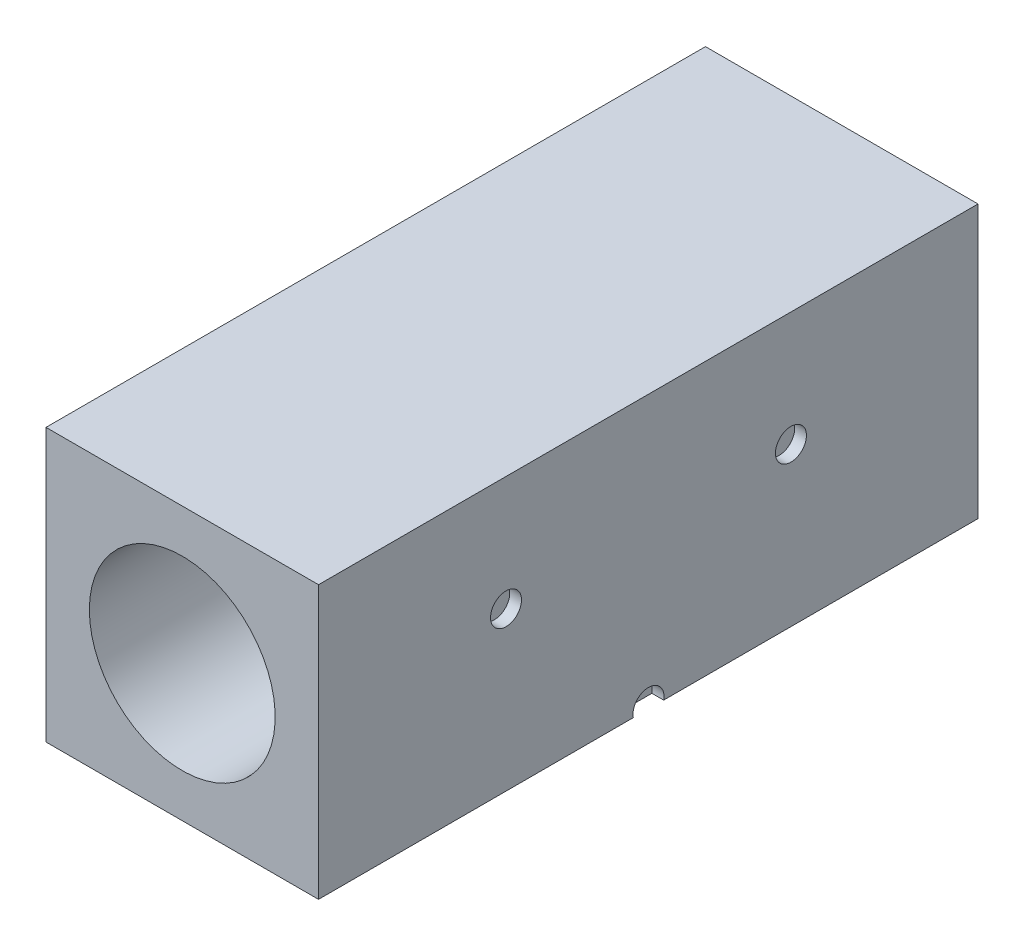
ISO-10303-21;
HEADER;
FILE_DESCRIPTION(('STEP AP214'),'2;1');
FILE_NAME('part.step','',(''),(''),'','','');
FILE_SCHEMA(('AUTOMOTIVE_DESIGN { 1 0 10303 214 1 1 1 1 }'));
ENDSEC;
DATA;
#1=APPLICATION_CONTEXT('core data for automotive mechanical design processes');
#2=APPLICATION_PROTOCOL_DEFINITION('international standard','automotive_design',2000,#1);
#3=PRODUCT_CONTEXT('',#1,'mechanical');
#4=PRODUCT('Part','Part','',(#3));
#5=PRODUCT_RELATED_PRODUCT_CATEGORY('part','',(#4));
#6=PRODUCT_DEFINITION_FORMATION('','',#4);
#7=PRODUCT_DEFINITION_CONTEXT('part definition',#1,'design');
#8=PRODUCT_DEFINITION('design','',#6,#7);
#9=PRODUCT_DEFINITION_SHAPE('','',#8);
#10=(LENGTH_UNIT() NAMED_UNIT(*) SI_UNIT(.MILLI.,.METRE.));
#11=(NAMED_UNIT(*) PLANE_ANGLE_UNIT() SI_UNIT($,.RADIAN.));
#12=(NAMED_UNIT(*) SI_UNIT($,.STERADIAN.) SOLID_ANGLE_UNIT());
#13=UNCERTAINTY_MEASURE_WITH_UNIT(LENGTH_MEASURE(1.E-05),#10,'distance_accuracy_value','');
#14=(GEOMETRIC_REPRESENTATION_CONTEXT(3) GLOBAL_UNCERTAINTY_ASSIGNED_CONTEXT((#13)) GLOBAL_UNIT_ASSIGNED_CONTEXT((#10,
#11,#12)) REPRESENTATION_CONTEXT('',''));
#15=CARTESIAN_POINT('',(0.,0.,0.));
#16=DIRECTION('',(0.,0.,1.));
#17=DIRECTION('',(1.,0.,0.));
#18=AXIS2_PLACEMENT_3D('',#15,#16,#17);
#19=CARTESIAN_POINT('',(-22.,-22.,106.47));
#20=DIRECTION('',(0.,1.,0.));
#21=DIRECTION('',(0.,0.,1.));
#22=AXIS2_PLACEMENT_3D('',#19,#20,#21);
#23=PLANE('',#22);
#24=DIRECTION('',(1.,0.,0.));
#25=VECTOR('',#24,1.);
#26=CARTESIAN_POINT('',(20.1,-22.,55.6493299851645));
#27=LINE('',#26,#25);
#28=CARTESIAN_POINT('',(22.,-22.,55.6493299851645));
#29=VERTEX_POINT('',#28);
#30=CARTESIAN_POINT('',(20.1,-22.,55.6493299851645));
#31=VERTEX_POINT('',#30);
#32=EDGE_CURVE('E11',#29,#31,#27,.F.);
#33=ORIENTED_EDGE('',*,*,#32,.F.);
#34=DIRECTION('',(0.,0.,-1.));
#35=VECTOR('',#34,1.);
#36=CARTESIAN_POINT('',(22.,-22.,106.47));
#37=LINE('',#36,#35);
#38=CARTESIAN_POINT('',(22.,-22.,106.47));
#39=VERTEX_POINT('',#38);
#40=EDGE_CURVE('E112',#39,#29,#37,.T.);
#41=ORIENTED_EDGE('',*,*,#40,.F.);
#42=DIRECTION('',(1.,0.,0.));
#43=VECTOR('',#42,1.);
#44=CARTESIAN_POINT('',(-22.,-22.,106.47));
#45=LINE('',#44,#43);
#46=CARTESIAN_POINT('',(-22.,-22.,106.47));
#47=VERTEX_POINT('',#46);
#48=EDGE_CURVE('E117',#47,#39,#45,.T.);
#49=ORIENTED_EDGE('',*,*,#48,.F.);
#50=DIRECTION('',(0.,0.,-1.));
#51=VECTOR('',#50,1.);
#52=CARTESIAN_POINT('',(-22.,-22.,106.47));
#53=LINE('',#52,#51);
#54=CARTESIAN_POINT('',(-22.,-22.,55.6493299851645));
#55=VERTEX_POINT('',#54);
#56=EDGE_CURVE('E125',#47,#55,#53,.T.);
#57=ORIENTED_EDGE('',*,*,#56,.T.);
#58=DIRECTION('',(-1.,0.,0.));
#59=VECTOR('',#58,1.);
#60=CARTESIAN_POINT('',(-20.1,-22.,55.6493299851645));
#61=LINE('',#60,#59);
#62=CARTESIAN_POINT('',(-20.1,-22.,55.6493299851645));
#63=VERTEX_POINT('',#62);
#64=EDGE_CURVE('E136',#55,#63,#61,.F.);
#65=ORIENTED_EDGE('',*,*,#64,.T.);
#66=DIRECTION('',(0.,0.,1.));
#67=VECTOR('',#66,1.);
#68=CARTESIAN_POINT('',(-20.1,-22.,106.47));
#69=LINE('',#68,#67);
#70=CARTESIAN_POINT('',(-20.1,-22.,50.7506700148355));
#71=VERTEX_POINT('',#70);
#72=EDGE_CURVE('E134',#71,#63,#69,.T.);
#73=ORIENTED_EDGE('',*,*,#72,.F.);
#74=DIRECTION('',(-1.,0.,0.));
#75=VECTOR('',#74,1.);
#76=CARTESIAN_POINT('',(-20.1,-22.,50.7506700148355));
#77=LINE('',#76,#75);
#78=CARTESIAN_POINT('',(-22.,-22.,50.7506700148355));
#79=VERTEX_POINT('',#78);
#80=EDGE_CURVE('E139',#71,#79,#77,.T.);
#81=ORIENTED_EDGE('',*,*,#80,.T.);
#82=CARTESIAN_POINT('',(-22.,-22.,0.));
#83=VERTEX_POINT('',#82);
#84=EDGE_CURVE('E119',#79,#83,#53,.T.);
#85=ORIENTED_EDGE('',*,*,#84,.T.);
#86=DIRECTION('',(1.,0.,0.));
#87=VECTOR('',#86,1.);
#88=CARTESIAN_POINT('',(-22.,-22.,0.));
#89=LINE('',#88,#87);
#90=CARTESIAN_POINT('',(22.,-22.,0.));
#91=VERTEX_POINT('',#90);
#92=EDGE_CURVE('E115',#83,#91,#89,.T.);
#93=ORIENTED_EDGE('',*,*,#92,.T.);
#94=CARTESIAN_POINT('',(22.,-22.,50.7506700148355));
#95=VERTEX_POINT('',#94);
#96=EDGE_CURVE('E108',#95,#91,#37,.T.);
#97=ORIENTED_EDGE('',*,*,#96,.F.);
#98=DIRECTION('',(1.,0.,0.));
#99=VECTOR('',#98,1.);
#100=CARTESIAN_POINT('',(20.1,-22.,50.7506700148355));
#101=LINE('',#100,#99);
#102=CARTESIAN_POINT('',(20.1,-22.,50.7506700148355));
#103=VERTEX_POINT('',#102);
#104=EDGE_CURVE('E42',#103,#95,#101,.T.);
#105=ORIENTED_EDGE('',*,*,#104,.F.);
#106=DIRECTION('',(0.,0.,-1.));
#107=VECTOR('',#106,1.);
#108=CARTESIAN_POINT('',(20.1,-22.,106.47));
#109=LINE('',#108,#107);
#110=EDGE_CURVE('E104',#31,#103,#109,.T.);
#111=ORIENTED_EDGE('',*,*,#110,.F.);
#112=EDGE_LOOP('',(#33,#41,#49,#57,#65,#73,#81,#85,#93,#97,#105,#111));
#113=FACE_BOUND('',#112,.T.);
#114=ADVANCED_FACE('F34',(#113),#23,.F.);
#115=CARTESIAN_POINT('',(22.,-22.,106.47));
#116=DIRECTION('',(-1.,0.,0.));
#117=DIRECTION('',(0.,0.,1.));
#118=AXIS2_PLACEMENT_3D('',#115,#116,#117);
#119=PLANE('',#118);
#120=CARTESIAN_POINT('',(22.,3.5,30.2));
#121=DIRECTION('',(-1.,0.,0.));
#122=DIRECTION('',(0.,0.,1.));
#123=AXIS2_PLACEMENT_3D('',#120,#121,#122);
#124=CIRCLE('',#123,2.5);
#125=CARTESIAN_POINT('',(22.,3.5,27.7));
#126=VERTEX_POINT('',#125);
#127=EDGE_CURVE('E273',#126,#126,#124,.T.);
#128=ORIENTED_EDGE('',*,*,#127,.T.);
#129=EDGE_LOOP('',(#128));
#130=FACE_BOUND('',#129,.T.);
#131=CARTESIAN_POINT('',(22.,3.5,76.2));
#132=DIRECTION('',(-1.,0.,0.));
#133=DIRECTION('',(0.,0.,1.));
#134=AXIS2_PLACEMENT_3D('',#131,#132,#133);
#135=CIRCLE('',#134,2.5);
#136=CARTESIAN_POINT('',(22.,3.5,73.7));
#137=VERTEX_POINT('',#136);
#138=EDGE_CURVE('E281',#137,#137,#135,.T.);
#139=ORIENTED_EDGE('',*,*,#138,.T.);
#140=EDGE_LOOP('',(#139));
#141=FACE_BOUND('',#140,.T.);
#142=CARTESIAN_POINT('',(22.,-21.4992179877691,53.2));
#143=DIRECTION('',(-1.,0.,0.));
#144=DIRECTION('',(0.,0.,1.));
#145=AXIS2_PLACEMENT_3D('',#142,#143,#144);
#146=CIRCLE('',#145,2.5);
#147=EDGE_CURVE('E99',#29,#95,#146,.T.);
#148=ORIENTED_EDGE('',*,*,#147,.T.);
#149=ORIENTED_EDGE('',*,*,#96,.T.);
#150=DIRECTION('',(0.,1.,0.));
#151=VECTOR('',#150,1.);
#152=CARTESIAN_POINT('',(22.,-22.,0.));
#153=LINE('',#152,#151);
#154=CARTESIAN_POINT('',(22.,22.,0.));
#155=VERTEX_POINT('',#154);
#156=EDGE_CURVE('E157',#91,#155,#153,.T.);
#157=ORIENTED_EDGE('',*,*,#156,.T.);
#158=DIRECTION('',(0.,0.,-1.));
#159=VECTOR('',#158,1.);
#160=CARTESIAN_POINT('',(22.,22.,106.47));
#161=LINE('',#160,#159);
#162=CARTESIAN_POINT('',(22.,22.,106.47));
#163=VERTEX_POINT('',#162);
#164=EDGE_CURVE('E131',#163,#155,#161,.T.);
#165=ORIENTED_EDGE('',*,*,#164,.F.);
#166=DIRECTION('',(0.,1.,0.));
#167=VECTOR('',#166,1.);
#168=CARTESIAN_POINT('',(22.,-22.,106.47));
#169=LINE('',#168,#167);
#170=EDGE_CURVE('E146',#39,#163,#169,.T.);
#171=ORIENTED_EDGE('',*,*,#170,.F.);
#172=ORIENTED_EDGE('',*,*,#40,.T.);
#173=EDGE_LOOP('',(#148,#149,#157,#165,#171,#172));
#174=FACE_BOUND('',#173,.T.);
#175=ADVANCED_FACE('F36',(#130,#141,#174),#119,.F.);
#176=CARTESIAN_POINT('',(-22.,22.,106.47));
#177=DIRECTION('',(0.,-1.,0.));
#178=DIRECTION('',(0.,0.,-1.));
#179=AXIS2_PLACEMENT_3D('',#176,#177,#178);
#180=PLANE('',#179);
#181=DIRECTION('',(-1.,0.,0.));
#182=VECTOR('',#181,1.);
#183=CARTESIAN_POINT('',(-22.,22.,0.));
#184=LINE('',#183,#182);
#185=CARTESIAN_POINT('',(-22.,22.,0.));
#186=VERTEX_POINT('',#185);
#187=EDGE_CURVE('E159',#155,#186,#184,.T.);
#188=ORIENTED_EDGE('',*,*,#187,.T.);
#189=DIRECTION('',(0.,0.,-1.));
#190=VECTOR('',#189,1.);
#191=CARTESIAN_POINT('',(-22.,22.,106.47));
#192=LINE('',#191,#190);
#193=CARTESIAN_POINT('',(-22.,22.,106.47));
#194=VERTEX_POINT('',#193);
#195=EDGE_CURVE('E128',#194,#186,#192,.T.);
#196=ORIENTED_EDGE('',*,*,#195,.F.);
#197=DIRECTION('',(-1.,0.,0.));
#198=VECTOR('',#197,1.);
#199=CARTESIAN_POINT('',(-22.,22.,106.47));
#200=LINE('',#199,#198);
#201=EDGE_CURVE('E148',#163,#194,#200,.T.);
#202=ORIENTED_EDGE('',*,*,#201,.F.);
#203=ORIENTED_EDGE('',*,*,#164,.T.);
#204=EDGE_LOOP('',(#188,#196,#202,#203));
#205=FACE_BOUND('',#204,.T.);
#206=ADVANCED_FACE('F172',(#205),#180,.F.);
#207=CARTESIAN_POINT('',(-22.,-22.,106.47));
#208=DIRECTION('',(1.,0.,0.));
#209=DIRECTION('',(0.,0.,-1.));
#210=AXIS2_PLACEMENT_3D('',#207,#208,#209);
#211=PLANE('',#210);
#212=CARTESIAN_POINT('',(-22.,3.5,30.2));
#213=DIRECTION('',(-1.,0.,0.));
#214=DIRECTION('',(0.,0.,1.));
#215=AXIS2_PLACEMENT_3D('',#212,#213,#214);
#216=CIRCLE('',#215,2.5);
#217=CARTESIAN_POINT('',(-22.,3.5,32.7));
#218=VERTEX_POINT('',#217);
#219=EDGE_CURVE('E195',#218,#218,#216,.T.);
#220=ORIENTED_EDGE('',*,*,#219,.F.);
#221=EDGE_LOOP('',(#220));
#222=FACE_BOUND('',#221,.T.);
#223=CARTESIAN_POINT('',(-22.,3.5,76.2));
#224=DIRECTION('',(-1.,0.,0.));
#225=DIRECTION('',(0.,0.,1.));
#226=AXIS2_PLACEMENT_3D('',#223,#224,#225);
#227=CIRCLE('',#226,2.5);
#228=CARTESIAN_POINT('',(-22.,3.5,78.7));
#229=VERTEX_POINT('',#228);
#230=EDGE_CURVE('E179',#229,#229,#227,.T.);
#231=ORIENTED_EDGE('',*,*,#230,.F.);
#232=EDGE_LOOP('',(#231));
#233=FACE_BOUND('',#232,.T.);
#234=ORIENTED_EDGE('',*,*,#84,.F.);
#235=CARTESIAN_POINT('',(-22.,-21.4992179877691,53.2));
#236=DIRECTION('',(-1.,0.,0.));
#237=DIRECTION('',(0.,0.,1.));
#238=AXIS2_PLACEMENT_3D('',#235,#236,#237);
#239=CIRCLE('',#238,2.5);
#240=EDGE_CURVE('E175',#55,#79,#239,.T.);
#241=ORIENTED_EDGE('',*,*,#240,.F.);
#242=ORIENTED_EDGE('',*,*,#56,.F.);
#243=DIRECTION('',(0.,-1.,0.));
#244=VECTOR('',#243,1.);
#245=CARTESIAN_POINT('',(-22.,-22.,106.47));
#246=LINE('',#245,#244);
#247=EDGE_CURVE('E120',#194,#47,#246,.T.);
#248=ORIENTED_EDGE('',*,*,#247,.F.);
#249=ORIENTED_EDGE('',*,*,#195,.T.);
#250=DIRECTION('',(0.,-1.,0.));
#251=VECTOR('',#250,1.);
#252=CARTESIAN_POINT('',(-22.,-22.,0.));
#253=LINE('',#252,#251);
#254=EDGE_CURVE('E151',#186,#83,#253,.T.);
#255=ORIENTED_EDGE('',*,*,#254,.T.);
#256=EDGE_LOOP('',(#234,#241,#242,#248,#249,#255));
#257=FACE_BOUND('',#256,.T.);
#258=ADVANCED_FACE('F165',(#222,#233,#257),#211,.F.);
#259=CARTESIAN_POINT('',(0.,0.,106.47));
#260=DIRECTION('',(0.,0.,-1.));
#261=DIRECTION('',(-1.,0.,0.));
#262=AXIS2_PLACEMENT_3D('',#259,#260,#261);
#263=PLANE('',#262);
#264=CARTESIAN_POINT('',(0.,0.,106.47));
#265=DIRECTION('',(0.,0.,-1.));
#266=DIRECTION('',(-1.,0.,0.));
#267=AXIS2_PLACEMENT_3D('',#264,#265,#266);
#268=CIRCLE('',#267,15.);
#269=CARTESIAN_POINT('',(-15.,0.,106.47));
#270=VERTEX_POINT('',#269);
#271=EDGE_CURVE('E160',#270,#270,#268,.T.);
#272=ORIENTED_EDGE('',*,*,#271,.T.);
#273=EDGE_LOOP('',(#272));
#274=FACE_BOUND('',#273,.T.);
#275=ORIENTED_EDGE('',*,*,#170,.T.);
#276=ORIENTED_EDGE('',*,*,#201,.T.);
#277=ORIENTED_EDGE('',*,*,#247,.T.);
#278=ORIENTED_EDGE('',*,*,#48,.T.);
#279=EDGE_LOOP('',(#275,#276,#277,#278));
#280=FACE_BOUND('',#279,.T.);
#281=ADVANCED_FACE('F173',(#274,#280),#263,.F.);
#282=CARTESIAN_POINT('',(0.,0.,0.));
#283=DIRECTION('',(0.,0.,-1.));
#284=DIRECTION('',(-1.,0.,0.));
#285=AXIS2_PLACEMENT_3D('',#282,#283,#284);
#286=PLANE('',#285);
#287=CARTESIAN_POINT('',(0.,0.,0.));
#288=DIRECTION('',(0.,0.,-1.));
#289=DIRECTION('',(-1.,0.,0.));
#290=AXIS2_PLACEMENT_3D('',#287,#288,#289);
#291=CIRCLE('',#290,15.);
#292=CARTESIAN_POINT('',(-15.,0.,0.));
#293=VERTEX_POINT('',#292);
#294=EDGE_CURVE('E153',#293,#293,#291,.T.);
#295=ORIENTED_EDGE('',*,*,#294,.F.);
#296=EDGE_LOOP('',(#295));
#297=FACE_BOUND('',#296,.T.);
#298=ORIENTED_EDGE('',*,*,#156,.F.);
#299=ORIENTED_EDGE('',*,*,#92,.F.);
#300=ORIENTED_EDGE('',*,*,#254,.F.);
#301=ORIENTED_EDGE('',*,*,#187,.F.);
#302=EDGE_LOOP('',(#298,#299,#300,#301));
#303=FACE_BOUND('',#302,.T.);
#304=ADVANCED_FACE('F170',(#297,#303),#286,.T.);
#305=CARTESIAN_POINT('',(0.,0.,106.47));
#306=DIRECTION('',(0.,0.,-1.));
#307=DIRECTION('',(-1.,0.,0.));
#308=AXIS2_PLACEMENT_3D('',#305,#306,#307);
#309=CYLINDRICAL_SURFACE('',#308,15.);
#310=CARTESIAN_POINT('',(-15.,0.,106.47));
#311=CARTESIAN_POINT('',(-15.,0.,105.3609375));
#312=CARTESIAN_POINT('',(-15.,0.,104.251875));
#313=CARTESIAN_POINT('',(-15.,0.,102.03375));
#314=CARTESIAN_POINT('',(-15.,0.,100.9246875));
#315=CARTESIAN_POINT('',(-15.,0.,98.7065625));
#316=CARTESIAN_POINT('',(-15.,0.,97.5975));
#317=CARTESIAN_POINT('',(-15.,0.,95.379375));
#318=CARTESIAN_POINT('',(-15.,0.,94.2703125));
#319=CARTESIAN_POINT('',(-15.,0.,92.0521875));
#320=CARTESIAN_POINT('',(-15.,0.,90.943125));
#321=CARTESIAN_POINT('',(-15.,0.,88.725));
#322=CARTESIAN_POINT('',(-15.,0.,87.6159375));
#323=CARTESIAN_POINT('',(-15.,0.,85.3978125));
#324=CARTESIAN_POINT('',(-15.,0.,84.28875));
#325=CARTESIAN_POINT('',(-15.,0.,82.070625));
#326=CARTESIAN_POINT('',(-15.,0.,80.9615625));
#327=CARTESIAN_POINT('',(-15.,0.,78.7434375));
#328=CARTESIAN_POINT('',(-15.,0.,77.634375));
#329=CARTESIAN_POINT('',(-15.,0.,75.41625));
#330=CARTESIAN_POINT('',(-15.,0.,74.3071875));
#331=CARTESIAN_POINT('',(-15.,0.,72.0890625));
#332=CARTESIAN_POINT('',(-15.,0.,70.98));
#333=CARTESIAN_POINT('',(-15.,0.,68.761875));
#334=CARTESIAN_POINT('',(-15.,0.,67.6528125));
#335=CARTESIAN_POINT('',(-15.,0.,65.4346875));
#336=CARTESIAN_POINT('',(-15.,0.,64.325625));
#337=CARTESIAN_POINT('',(-15.,0.,62.1075));
#338=CARTESIAN_POINT('',(-15.,0.,60.9984375));
#339=CARTESIAN_POINT('',(-15.,0.,58.7803125));
#340=CARTESIAN_POINT('',(-15.,0.,57.67125));
#341=CARTESIAN_POINT('',(-15.,0.,55.453125));
#342=CARTESIAN_POINT('',(-15.,0.,54.3440625));
#343=CARTESIAN_POINT('',(-15.,0.,52.1259375));
#344=CARTESIAN_POINT('',(-15.,0.,51.016875));
#345=CARTESIAN_POINT('',(-15.,0.,48.79875));
#346=CARTESIAN_POINT('',(-15.,0.,47.6896875));
#347=CARTESIAN_POINT('',(-15.,0.,45.4715625));
#348=CARTESIAN_POINT('',(-15.,0.,44.3625));
#349=CARTESIAN_POINT('',(-15.,0.,42.144375));
#350=CARTESIAN_POINT('',(-15.,0.,41.0353125));
#351=CARTESIAN_POINT('',(-15.,0.,38.8171875));
#352=CARTESIAN_POINT('',(-15.,0.,37.708125));
#353=CARTESIAN_POINT('',(-15.,0.,35.49));
#354=CARTESIAN_POINT('',(-15.,0.,34.3809375));
#355=CARTESIAN_POINT('',(-15.,0.,32.1628125));
#356=CARTESIAN_POINT('',(-15.,0.,31.05375));
#357=CARTESIAN_POINT('',(-15.,0.,28.835625));
#358=CARTESIAN_POINT('',(-15.,0.,27.7265625));
#359=CARTESIAN_POINT('',(-15.,0.,25.5084375));
#360=CARTESIAN_POINT('',(-15.,0.,24.399375));
#361=CARTESIAN_POINT('',(-15.,0.,22.18125));
#362=CARTESIAN_POINT('',(-15.,0.,21.0721875));
#363=CARTESIAN_POINT('',(-15.,0.,18.8540625));
#364=CARTESIAN_POINT('',(-15.,0.,17.745));
#365=CARTESIAN_POINT('',(-15.,0.,15.526875));
#366=CARTESIAN_POINT('',(-15.,0.,14.4178125));
#367=CARTESIAN_POINT('',(-15.,0.,12.1996875));
#368=CARTESIAN_POINT('',(-15.,0.,11.090625));
#369=CARTESIAN_POINT('',(-15.,0.,8.8725));
#370=CARTESIAN_POINT('',(-15.,0.,7.7634375));
#371=CARTESIAN_POINT('',(-15.,0.,5.5453125));
#372=CARTESIAN_POINT('',(-15.,0.,4.43625));
#373=CARTESIAN_POINT('',(-15.,0.,2.218125));
#374=CARTESIAN_POINT('',(-15.,0.,1.1090625));
#375=CARTESIAN_POINT('',(-15.,0.,0.));
#376=B_SPLINE_CURVE_WITH_KNOTS('',3,(#310,#311,#312,#313,#314,#315,#316,#317,#318,#319,#320,
#321,#322,#323,#324,#325,#326,#327,#328,#329,#330,#331,#332,#333,#334,#335,#336,#337,#338,#339,
#340,#341,#342,#343,#344,#345,#346,#347,#348,#349,#350,#351,#352,#353,#354,#355,#356,#357,#358,
#359,#360,#361,#362,#363,#364,#365,#366,#367,#368,#369,#370,#371,#372,#373,#374,#375),
.UNSPECIFIED.,.F.,.F.,(4,2,2,2,2,2,2,2,2,2,2,2,2,2,2,2,2,2,2,2,2,2,2,2,2,2,2,2,2,2,2,2,4),(0.,
3.32718750000001,6.654375,9.98156250000001,13.30875,16.6359375,19.963125,23.2903125,26.6175,
29.9446875,33.271875,36.5990625,39.92625,43.2534375,46.580625,49.9078125,53.235,56.5621875,
59.889375,63.2165625,66.54375,69.8709375,73.198125,76.5253125,79.8525,83.1796875,86.506875,
89.8340625,93.16125,96.4884375,99.815625,103.1428125,106.47),.UNSPECIFIED.);
#377=EDGE_CURVE('BSEAM231',#270,#293,#376,.T.);
#378=ORIENTED_EDGE('',*,*,#271,.F.);
#379=ORIENTED_EDGE('',*,*,#294,.T.);
#380=ORIENTED_EDGE('',*,*,#377,.T.);
#381=ORIENTED_EDGE('',*,*,#377,.F.);
#382=EDGE_LOOP('',(#378,#380,#379,#381));
#383=FACE_BOUND('',#382,.T.);
#384=ADVANCED_FACE('F231',(#383),#309,.F.);
#385=CARTESIAN_POINT('',(-20.1,-21.4992179877691,53.2));
#386=DIRECTION('',(-1.,0.,0.));
#387=DIRECTION('',(0.,0.,1.));
#388=AXIS2_PLACEMENT_3D('',#385,#386,#387);
#389=CYLINDRICAL_SURFACE('',#388,2.5);
#390=CARTESIAN_POINT('',(-20.1,-21.4992179877691,53.2));
#391=DIRECTION('',(-1.,0.,0.));
#392=DIRECTION('',(0.,0.,1.));
#393=AXIS2_PLACEMENT_3D('',#390,#391,#392);
#394=CIRCLE('',#393,2.5);
#395=EDGE_CURVE('E54',#63,#71,#394,.T.);
#396=ORIENTED_EDGE('',*,*,#395,.F.);
#397=ORIENTED_EDGE('',*,*,#64,.F.);
#398=ORIENTED_EDGE('',*,*,#240,.T.);
#399=ORIENTED_EDGE('',*,*,#80,.F.);
#400=EDGE_LOOP('',(#396,#397,#398,#399));
#401=FACE_BOUND('',#400,.T.);
#402=ADVANCED_FACE('F178',(#401),#389,.F.);
#403=CARTESIAN_POINT('',(-20.1,-21.4992179877691,53.2));
#404=DIRECTION('',(-1.,0.,0.));
#405=DIRECTION('',(0.,0.,1.));
#406=AXIS2_PLACEMENT_3D('',#403,#404,#405);
#407=PLANE('',#406);
#408=ORIENTED_EDGE('',*,*,#72,.T.);
#409=ORIENTED_EDGE('',*,*,#395,.T.);
#410=EDGE_LOOP('',(#408,#409));
#411=FACE_BOUND('',#410,.T.);
#412=ADVANCED_FACE('F210',(#411),#407,.T.);
#413=CARTESIAN_POINT('',(-20.1,3.5,76.2));
#414=DIRECTION('',(-1.,0.,0.));
#415=DIRECTION('',(0.,0.,1.));
#416=AXIS2_PLACEMENT_3D('',#413,#414,#415);
#417=CYLINDRICAL_SURFACE('',#416,2.5);
#418=CARTESIAN_POINT('',(-20.1,3.5,76.2));
#419=DIRECTION('',(-1.,0.,0.));
#420=DIRECTION('',(0.,0.,1.));
#421=AXIS2_PLACEMENT_3D('',#418,#419,#420);
#422=CIRCLE('',#421,2.5);
#423=CARTESIAN_POINT('',(-20.1,3.5,78.7));
#424=VERTEX_POINT('',#423);
#425=EDGE_CURVE('E182',#424,#424,#422,.T.);
#426=CARTESIAN_POINT('',(-20.1,3.5,78.7));
#427=CARTESIAN_POINT('',(-20.1197916666667,3.5,78.7));
#428=CARTESIAN_POINT('',(-20.1395833333333,3.5,78.7));
#429=CARTESIAN_POINT('',(-20.1791666666667,3.5,78.7));
#430=CARTESIAN_POINT('',(-20.1989583333333,3.5,78.7));
#431=CARTESIAN_POINT('',(-20.2385416666667,3.5,78.7));
#432=CARTESIAN_POINT('',(-20.2583333333333,3.5,78.7));
#433=CARTESIAN_POINT('',(-20.2979166666667,3.5,78.7));
#434=CARTESIAN_POINT('',(-20.3177083333333,3.5,78.7));
#435=CARTESIAN_POINT('',(-20.3572916666667,3.5,78.7));
#436=CARTESIAN_POINT('',(-20.3770833333333,3.5,78.7));
#437=CARTESIAN_POINT('',(-20.4166666666667,3.5,78.7));
#438=CARTESIAN_POINT('',(-20.4364583333333,3.5,78.7));
#439=CARTESIAN_POINT('',(-20.4760416666667,3.5,78.7));
#440=CARTESIAN_POINT('',(-20.4958333333333,3.5,78.7));
#441=CARTESIAN_POINT('',(-20.5354166666667,3.5,78.7));
#442=CARTESIAN_POINT('',(-20.5552083333333,3.5,78.7));
#443=CARTESIAN_POINT('',(-20.5947916666667,3.5,78.7));
#444=CARTESIAN_POINT('',(-20.6145833333333,3.5,78.7));
#445=CARTESIAN_POINT('',(-20.6541666666667,3.5,78.7));
#446=CARTESIAN_POINT('',(-20.6739583333333,3.5,78.7));
#447=CARTESIAN_POINT('',(-20.7135416666667,3.5,78.7));
#448=CARTESIAN_POINT('',(-20.7333333333333,3.5,78.7));
#449=CARTESIAN_POINT('',(-20.7729166666667,3.5,78.7));
#450=CARTESIAN_POINT('',(-20.7927083333333,3.5,78.7));
#451=CARTESIAN_POINT('',(-20.8322916666667,3.5,78.7));
#452=CARTESIAN_POINT('',(-20.8520833333333,3.5,78.7));
#453=CARTESIAN_POINT('',(-20.8916666666667,3.5,78.7));
#454=CARTESIAN_POINT('',(-20.9114583333333,3.5,78.7));
#455=CARTESIAN_POINT('',(-20.9510416666667,3.5,78.7));
#456=CARTESIAN_POINT('',(-20.9708333333333,3.5,78.7));
#457=CARTESIAN_POINT('',(-21.0104166666667,3.5,78.7));
#458=CARTESIAN_POINT('',(-21.0302083333333,3.5,78.7));
#459=CARTESIAN_POINT('',(-21.0697916666667,3.5,78.7));
#460=CARTESIAN_POINT('',(-21.0895833333333,3.5,78.7));
#461=CARTESIAN_POINT('',(-21.1291666666667,3.5,78.7));
#462=CARTESIAN_POINT('',(-21.1489583333333,3.5,78.7));
#463=CARTESIAN_POINT('',(-21.1885416666667,3.5,78.7));
#464=CARTESIAN_POINT('',(-21.2083333333333,3.5,78.7));
#465=CARTESIAN_POINT('',(-21.2479166666667,3.5,78.7));
#466=CARTESIAN_POINT('',(-21.2677083333333,3.5,78.7));
#467=CARTESIAN_POINT('',(-21.3072916666667,3.5,78.7));
#468=CARTESIAN_POINT('',(-21.3270833333333,3.5,78.7));
#469=CARTESIAN_POINT('',(-21.3666666666667,3.5,78.7));
#470=CARTESIAN_POINT('',(-21.3864583333333,3.5,78.7));
#471=CARTESIAN_POINT('',(-21.4260416666667,3.5,78.7));
#472=CARTESIAN_POINT('',(-21.4458333333333,3.5,78.7));
#473=CARTESIAN_POINT('',(-21.4854166666667,3.5,78.7));
#474=CARTESIAN_POINT('',(-21.5052083333333,3.5,78.7));
#475=CARTESIAN_POINT('',(-21.5447916666667,3.5,78.7));
#476=CARTESIAN_POINT('',(-21.5645833333333,3.5,78.7));
#477=CARTESIAN_POINT('',(-21.6041666666667,3.5,78.7));
#478=CARTESIAN_POINT('',(-21.6239583333333,3.5,78.7));
#479=CARTESIAN_POINT('',(-21.6635416666667,3.5,78.7));
#480=CARTESIAN_POINT('',(-21.6833333333333,3.5,78.7));
#481=CARTESIAN_POINT('',(-21.7229166666667,3.5,78.7));
#482=CARTESIAN_POINT('',(-21.7427083333333,3.5,78.7));
#483=CARTESIAN_POINT('',(-21.7822916666667,3.5,78.7));
#484=CARTESIAN_POINT('',(-21.8020833333333,3.5,78.7));
#485=CARTESIAN_POINT('',(-21.8416666666667,3.5,78.7));
#486=CARTESIAN_POINT('',(-21.8614583333333,3.5,78.7));
#487=CARTESIAN_POINT('',(-21.9010416666667,3.5,78.7));
#488=CARTESIAN_POINT('',(-21.9208333333333,3.5,78.7));
#489=CARTESIAN_POINT('',(-21.9604166666667,3.5,78.7));
#490=CARTESIAN_POINT('',(-21.9802083333333,3.5,78.7));
#491=CARTESIAN_POINT('',(-22.,3.5,78.7));
#492=B_SPLINE_CURVE_WITH_KNOTS('',3,(#426,#427,#428,#429,#430,#431,#432,#433,#434,#435,#436,
#437,#438,#439,#440,#441,#442,#443,#444,#445,#446,#447,#448,#449,#450,#451,#452,#453,#454,#455,
#456,#457,#458,#459,#460,#461,#462,#463,#464,#465,#466,#467,#468,#469,#470,#471,#472,#473,#474,
#475,#476,#477,#478,#479,#480,#481,#482,#483,#484,#485,#486,#487,#488,#489,#490,#491),
.UNSPECIFIED.,.F.,.F.,(4,2,2,2,2,2,2,2,2,2,2,2,2,2,2,2,2,2,2,2,2,2,2,2,2,2,2,2,2,2,2,2,4),(0.,
0.0593750000000004,0.118750000000001,0.178125000000001,0.237500000000002,0.296875000000002,
0.356250000000002,0.415625000000003,0.475000000000003,0.534375,0.593750000000001,
0.653125000000001,0.712500000000001,0.771875000000002,0.831250000000002,0.890625000000003,
0.950000000000003,1.009375,1.06875,1.128125,1.1875,1.246875,1.30625,1.365625,1.425,1.484375,
1.54375,1.603125,1.6625,1.721875,1.78125,1.840625,1.9),.UNSPECIFIED.);
#493=EDGE_CURVE('BSEAM207',#424,#229,#492,.T.);
#494=ORIENTED_EDGE('',*,*,#425,.F.);
#495=ORIENTED_EDGE('',*,*,#230,.T.);
#496=ORIENTED_EDGE('',*,*,#493,.T.);
#497=ORIENTED_EDGE('',*,*,#493,.F.);
#498=EDGE_LOOP('',(#494,#496,#495,#497));
#499=FACE_BOUND('',#498,.T.);
#500=ADVANCED_FACE('F207',(#499),#417,.F.);
#501=CARTESIAN_POINT('',(-20.1,3.5,76.2));
#502=DIRECTION('',(-1.,0.,0.));
#503=DIRECTION('',(0.,0.,1.));
#504=AXIS2_PLACEMENT_3D('',#501,#502,#503);
#505=PLANE('',#504);
#506=ORIENTED_EDGE('',*,*,#425,.T.);
#507=EDGE_LOOP('',(#506));
#508=FACE_BOUND('',#507,.T.);
#509=ADVANCED_FACE('F205',(#508),#505,.T.);
#510=CARTESIAN_POINT('',(-20.1,3.5,30.2));
#511=DIRECTION('',(-1.,0.,0.));
#512=DIRECTION('',(0.,0.,1.));
#513=AXIS2_PLACEMENT_3D('',#510,#511,#512);
#514=CYLINDRICAL_SURFACE('',#513,2.5);
#515=CARTESIAN_POINT('',(-20.1,3.5,30.2));
#516=DIRECTION('',(-1.,0.,0.));
#517=DIRECTION('',(0.,0.,1.));
#518=AXIS2_PLACEMENT_3D('',#515,#516,#517);
#519=CIRCLE('',#518,2.5);
#520=CARTESIAN_POINT('',(-20.1,3.5,32.7));
#521=VERTEX_POINT('',#520);
#522=EDGE_CURVE('E191',#521,#521,#519,.T.);
#523=CARTESIAN_POINT('',(-20.1,3.5,32.7));
#524=CARTESIAN_POINT('',(-20.1197916666667,3.5,32.7));
#525=CARTESIAN_POINT('',(-20.1395833333333,3.5,32.7));
#526=CARTESIAN_POINT('',(-20.1791666666667,3.5,32.7));
#527=CARTESIAN_POINT('',(-20.1989583333333,3.5,32.7));
#528=CARTESIAN_POINT('',(-20.2385416666667,3.5,32.7));
#529=CARTESIAN_POINT('',(-20.2583333333333,3.5,32.7));
#530=CARTESIAN_POINT('',(-20.2979166666667,3.5,32.7));
#531=CARTESIAN_POINT('',(-20.3177083333333,3.5,32.7));
#532=CARTESIAN_POINT('',(-20.3572916666667,3.5,32.7));
#533=CARTESIAN_POINT('',(-20.3770833333333,3.5,32.7));
#534=CARTESIAN_POINT('',(-20.4166666666667,3.5,32.7));
#535=CARTESIAN_POINT('',(-20.4364583333333,3.5,32.7));
#536=CARTESIAN_POINT('',(-20.4760416666667,3.5,32.7));
#537=CARTESIAN_POINT('',(-20.4958333333333,3.5,32.7));
#538=CARTESIAN_POINT('',(-20.5354166666667,3.5,32.7));
#539=CARTESIAN_POINT('',(-20.5552083333333,3.5,32.7));
#540=CARTESIAN_POINT('',(-20.5947916666667,3.5,32.7));
#541=CARTESIAN_POINT('',(-20.6145833333333,3.5,32.7));
#542=CARTESIAN_POINT('',(-20.6541666666667,3.5,32.7));
#543=CARTESIAN_POINT('',(-20.6739583333333,3.5,32.7));
#544=CARTESIAN_POINT('',(-20.7135416666667,3.5,32.7));
#545=CARTESIAN_POINT('',(-20.7333333333333,3.5,32.7));
#546=CARTESIAN_POINT('',(-20.7729166666667,3.5,32.7));
#547=CARTESIAN_POINT('',(-20.7927083333333,3.5,32.7));
#548=CARTESIAN_POINT('',(-20.8322916666667,3.5,32.7));
#549=CARTESIAN_POINT('',(-20.8520833333333,3.5,32.7));
#550=CARTESIAN_POINT('',(-20.8916666666667,3.5,32.7));
#551=CARTESIAN_POINT('',(-20.9114583333333,3.5,32.7));
#552=CARTESIAN_POINT('',(-20.9510416666667,3.5,32.7));
#553=CARTESIAN_POINT('',(-20.9708333333333,3.5,32.7));
#554=CARTESIAN_POINT('',(-21.0104166666667,3.5,32.7));
#555=CARTESIAN_POINT('',(-21.0302083333333,3.5,32.7));
#556=CARTESIAN_POINT('',(-21.0697916666667,3.5,32.7));
#557=CARTESIAN_POINT('',(-21.0895833333333,3.5,32.7));
#558=CARTESIAN_POINT('',(-21.1291666666667,3.5,32.7));
#559=CARTESIAN_POINT('',(-21.1489583333333,3.5,32.7));
#560=CARTESIAN_POINT('',(-21.1885416666667,3.5,32.7));
#561=CARTESIAN_POINT('',(-21.2083333333333,3.5,32.7));
#562=CARTESIAN_POINT('',(-21.2479166666667,3.5,32.7));
#563=CARTESIAN_POINT('',(-21.2677083333333,3.5,32.7));
#564=CARTESIAN_POINT('',(-21.3072916666667,3.5,32.7));
#565=CARTESIAN_POINT('',(-21.3270833333333,3.5,32.7));
#566=CARTESIAN_POINT('',(-21.3666666666667,3.5,32.7));
#567=CARTESIAN_POINT('',(-21.3864583333333,3.5,32.7));
#568=CARTESIAN_POINT('',(-21.4260416666667,3.5,32.7));
#569=CARTESIAN_POINT('',(-21.4458333333333,3.5,32.7));
#570=CARTESIAN_POINT('',(-21.4854166666667,3.5,32.7));
#571=CARTESIAN_POINT('',(-21.5052083333333,3.5,32.7));
#572=CARTESIAN_POINT('',(-21.5447916666667,3.5,32.7));
#573=CARTESIAN_POINT('',(-21.5645833333333,3.5,32.7));
#574=CARTESIAN_POINT('',(-21.6041666666667,3.5,32.7));
#575=CARTESIAN_POINT('',(-21.6239583333333,3.5,32.7));
#576=CARTESIAN_POINT('',(-21.6635416666667,3.5,32.7));
#577=CARTESIAN_POINT('',(-21.6833333333333,3.5,32.7));
#578=CARTESIAN_POINT('',(-21.7229166666667,3.5,32.7));
#579=CARTESIAN_POINT('',(-21.7427083333333,3.5,32.7));
#580=CARTESIAN_POINT('',(-21.7822916666667,3.5,32.7));
#581=CARTESIAN_POINT('',(-21.8020833333333,3.5,32.7));
#582=CARTESIAN_POINT('',(-21.8416666666667,3.5,32.7));
#583=CARTESIAN_POINT('',(-21.8614583333333,3.5,32.7));
#584=CARTESIAN_POINT('',(-21.9010416666667,3.5,32.7));
#585=CARTESIAN_POINT('',(-21.9208333333333,3.5,32.7));
#586=CARTESIAN_POINT('',(-21.9604166666667,3.5,32.7));
#587=CARTESIAN_POINT('',(-21.9802083333333,3.5,32.7));
#588=CARTESIAN_POINT('',(-22.,3.5,32.7));
#589=B_SPLINE_CURVE_WITH_KNOTS('',3,(#523,#524,#525,#526,#527,#528,#529,#530,#531,#532,#533,
#534,#535,#536,#537,#538,#539,#540,#541,#542,#543,#544,#545,#546,#547,#548,#549,#550,#551,#552,
#553,#554,#555,#556,#557,#558,#559,#560,#561,#562,#563,#564,#565,#566,#567,#568,#569,#570,#571,
#572,#573,#574,#575,#576,#577,#578,#579,#580,#581,#582,#583,#584,#585,#586,#587,#588),
.UNSPECIFIED.,.F.,.F.,(4,2,2,2,2,2,2,2,2,2,2,2,2,2,2,2,2,2,2,2,2,2,2,2,2,2,2,2,2,2,2,2,4),(0.,
0.0593750000000004,0.118750000000001,0.178125000000001,0.237500000000002,0.296875000000002,
0.356250000000002,0.415625000000003,0.475000000000003,0.534375,0.593750000000001,
0.653125000000001,0.712500000000001,0.771875000000002,0.831250000000002,0.890625000000003,
0.950000000000003,1.009375,1.06875,1.128125,1.1875,1.246875,1.30625,1.365625,1.425,1.484375,
1.54375,1.603125,1.6625,1.721875,1.78125,1.840625,1.9),.UNSPECIFIED.);
#590=EDGE_CURVE('BSEAM243',#521,#218,#589,.T.);
#591=ORIENTED_EDGE('',*,*,#522,.F.);
#592=ORIENTED_EDGE('',*,*,#219,.T.);
#593=ORIENTED_EDGE('',*,*,#590,.T.);
#594=ORIENTED_EDGE('',*,*,#590,.F.);
#595=EDGE_LOOP('',(#591,#593,#592,#594));
#596=FACE_BOUND('',#595,.T.);
#597=ADVANCED_FACE('F243',(#596),#514,.F.);
#598=CARTESIAN_POINT('',(-20.1,3.5,30.2));
#599=DIRECTION('',(-1.,0.,0.));
#600=DIRECTION('',(0.,0.,1.));
#601=AXIS2_PLACEMENT_3D('',#598,#599,#600);
#602=PLANE('',#601);
#603=ORIENTED_EDGE('',*,*,#522,.T.);
#604=EDGE_LOOP('',(#603));
#605=FACE_BOUND('',#604,.T.);
#606=ADVANCED_FACE('F246',(#605),#602,.T.);
#607=CARTESIAN_POINT('',(20.1,-21.4992179877691,53.2));
#608=DIRECTION('',(1.,0.,0.));
#609=DIRECTION('',(0.,0.,-1.));
#610=AXIS2_PLACEMENT_3D('',#607,#608,#609);
#611=CYLINDRICAL_SURFACE('',#610,2.5);
#612=ORIENTED_EDGE('',*,*,#32,.T.);
#613=CARTESIAN_POINT('',(20.1,-21.4992179877691,53.2));
#614=DIRECTION('',(-1.,0.,0.));
#615=DIRECTION('',(0.,0.,1.));
#616=AXIS2_PLACEMENT_3D('',#613,#614,#615);
#617=CIRCLE('',#616,2.5);
#618=EDGE_CURVE('E48',#31,#103,#617,.T.);
#619=ORIENTED_EDGE('',*,*,#618,.T.);
#620=ORIENTED_EDGE('',*,*,#104,.T.);
#621=ORIENTED_EDGE('',*,*,#147,.F.);
#622=EDGE_LOOP('',(#612,#619,#620,#621));
#623=FACE_BOUND('',#622,.T.);
#624=ADVANCED_FACE('F98',(#623),#611,.F.);
#625=CARTESIAN_POINT('',(20.1,-21.4992179877691,53.2));
#626=DIRECTION('',(1.,0.,0.));
#627=DIRECTION('',(0.,0.,1.));
#628=AXIS2_PLACEMENT_3D('',#625,#626,#627);
#629=PLANE('',#628);
#630=ORIENTED_EDGE('',*,*,#110,.T.);
#631=ORIENTED_EDGE('',*,*,#618,.F.);
#632=EDGE_LOOP('',(#630,#631));
#633=FACE_BOUND('',#632,.T.);
#634=ADVANCED_FACE('F142',(#633),#629,.T.);
#635=CARTESIAN_POINT('',(20.1,3.5,76.2));
#636=DIRECTION('',(1.,0.,0.));
#637=DIRECTION('',(0.,0.,-1.));
#638=AXIS2_PLACEMENT_3D('',#635,#636,#637);
#639=CYLINDRICAL_SURFACE('',#638,2.5);
#640=CARTESIAN_POINT('',(20.1,3.5,76.2));
#641=DIRECTION('',(-1.,0.,0.));
#642=DIRECTION('',(0.,0.,1.));
#643=AXIS2_PLACEMENT_3D('',#640,#641,#642);
#644=CIRCLE('',#643,2.5);
#645=CARTESIAN_POINT('',(20.1,3.5,73.7));
#646=VERTEX_POINT('',#645);
#647=EDGE_CURVE('E276',#646,#646,#644,.T.);
#648=CARTESIAN_POINT('',(20.1,3.5,73.7));
#649=CARTESIAN_POINT('',(20.1197916666667,3.5,73.7));
#650=CARTESIAN_POINT('',(20.1395833333333,3.5,73.7));
#651=CARTESIAN_POINT('',(20.1791666666667,3.5,73.7));
#652=CARTESIAN_POINT('',(20.1989583333333,3.5,73.7));
#653=CARTESIAN_POINT('',(20.2385416666667,3.5,73.7));
#654=CARTESIAN_POINT('',(20.2583333333333,3.5,73.7));
#655=CARTESIAN_POINT('',(20.2979166666667,3.5,73.7));
#656=CARTESIAN_POINT('',(20.3177083333333,3.5,73.7));
#657=CARTESIAN_POINT('',(20.3572916666667,3.5,73.7));
#658=CARTESIAN_POINT('',(20.3770833333333,3.5,73.7));
#659=CARTESIAN_POINT('',(20.4166666666667,3.5,73.7));
#660=CARTESIAN_POINT('',(20.4364583333333,3.5,73.7));
#661=CARTESIAN_POINT('',(20.4760416666667,3.5,73.7));
#662=CARTESIAN_POINT('',(20.4958333333333,3.5,73.7));
#663=CARTESIAN_POINT('',(20.5354166666667,3.5,73.7));
#664=CARTESIAN_POINT('',(20.5552083333333,3.5,73.7));
#665=CARTESIAN_POINT('',(20.5947916666667,3.5,73.7));
#666=CARTESIAN_POINT('',(20.6145833333333,3.5,73.7));
#667=CARTESIAN_POINT('',(20.6541666666667,3.5,73.7));
#668=CARTESIAN_POINT('',(20.6739583333333,3.5,73.7));
#669=CARTESIAN_POINT('',(20.7135416666667,3.5,73.7));
#670=CARTESIAN_POINT('',(20.7333333333333,3.5,73.7));
#671=CARTESIAN_POINT('',(20.7729166666667,3.5,73.7));
#672=CARTESIAN_POINT('',(20.7927083333333,3.5,73.7));
#673=CARTESIAN_POINT('',(20.8322916666667,3.5,73.7));
#674=CARTESIAN_POINT('',(20.8520833333333,3.5,73.7));
#675=CARTESIAN_POINT('',(20.8916666666667,3.5,73.7));
#676=CARTESIAN_POINT('',(20.9114583333333,3.5,73.7));
#677=CARTESIAN_POINT('',(20.9510416666667,3.5,73.7));
#678=CARTESIAN_POINT('',(20.9708333333333,3.5,73.7));
#679=CARTESIAN_POINT('',(21.0104166666667,3.5,73.7));
#680=CARTESIAN_POINT('',(21.0302083333333,3.5,73.7));
#681=CARTESIAN_POINT('',(21.0697916666667,3.5,73.7));
#682=CARTESIAN_POINT('',(21.0895833333333,3.5,73.7));
#683=CARTESIAN_POINT('',(21.1291666666667,3.5,73.7));
#684=CARTESIAN_POINT('',(21.1489583333333,3.5,73.7));
#685=CARTESIAN_POINT('',(21.1885416666667,3.5,73.7));
#686=CARTESIAN_POINT('',(21.2083333333333,3.5,73.7));
#687=CARTESIAN_POINT('',(21.2479166666667,3.5,73.7));
#688=CARTESIAN_POINT('',(21.2677083333333,3.5,73.7));
#689=CARTESIAN_POINT('',(21.3072916666667,3.5,73.7));
#690=CARTESIAN_POINT('',(21.3270833333333,3.5,73.7));
#691=CARTESIAN_POINT('',(21.3666666666667,3.5,73.7));
#692=CARTESIAN_POINT('',(21.3864583333333,3.5,73.7));
#693=CARTESIAN_POINT('',(21.4260416666667,3.5,73.7));
#694=CARTESIAN_POINT('',(21.4458333333333,3.5,73.7));
#695=CARTESIAN_POINT('',(21.4854166666667,3.5,73.7));
#696=CARTESIAN_POINT('',(21.5052083333333,3.5,73.7));
#697=CARTESIAN_POINT('',(21.5447916666667,3.5,73.7));
#698=CARTESIAN_POINT('',(21.5645833333333,3.5,73.7));
#699=CARTESIAN_POINT('',(21.6041666666667,3.5,73.7));
#700=CARTESIAN_POINT('',(21.6239583333333,3.5,73.7));
#701=CARTESIAN_POINT('',(21.6635416666667,3.5,73.7));
#702=CARTESIAN_POINT('',(21.6833333333333,3.5,73.7));
#703=CARTESIAN_POINT('',(21.7229166666667,3.5,73.7));
#704=CARTESIAN_POINT('',(21.7427083333333,3.5,73.7));
#705=CARTESIAN_POINT('',(21.7822916666667,3.5,73.7));
#706=CARTESIAN_POINT('',(21.8020833333333,3.5,73.7));
#707=CARTESIAN_POINT('',(21.8416666666667,3.5,73.7));
#708=CARTESIAN_POINT('',(21.8614583333333,3.5,73.7));
#709=CARTESIAN_POINT('',(21.9010416666667,3.5,73.7));
#710=CARTESIAN_POINT('',(21.9208333333333,3.5,73.7));
#711=CARTESIAN_POINT('',(21.9604166666667,3.5,73.7));
#712=CARTESIAN_POINT('',(21.9802083333333,3.5,73.7));
#713=CARTESIAN_POINT('',(22.,3.5,73.7));
#714=B_SPLINE_CURVE_WITH_KNOTS('',3,(#648,#649,#650,#651,#652,#653,#654,#655,#656,#657,#658,
#659,#660,#661,#662,#663,#664,#665,#666,#667,#668,#669,#670,#671,#672,#673,#674,#675,#676,#677,
#678,#679,#680,#681,#682,#683,#684,#685,#686,#687,#688,#689,#690,#691,#692,#693,#694,#695,#696,
#697,#698,#699,#700,#701,#702,#703,#704,#705,#706,#707,#708,#709,#710,#711,#712,#713),
.UNSPECIFIED.,.F.,.F.,(4,2,2,2,2,2,2,2,2,2,2,2,2,2,2,2,2,2,2,2,2,2,2,2,2,2,2,2,2,2,2,2,4),(0.,
0.0593750000000004,0.118750000000001,0.178125000000001,0.237500000000002,0.296875000000002,
0.356250000000002,0.415625000000003,0.475,0.534375,0.593750000000001,0.653125000000001,
0.712500000000001,0.771875000000002,0.831250000000002,0.890625000000003,0.95,1.009375,1.06875,
1.128125,1.1875,1.246875,1.30625,1.365625,1.425,1.484375,1.54375,1.603125,1.6625,1.721875,
1.78125,1.840625,1.9),.UNSPECIFIED.);
#715=EDGE_CURVE('BSEAM254',#646,#137,#714,.T.);
#716=ORIENTED_EDGE('',*,*,#647,.T.);
#717=ORIENTED_EDGE('',*,*,#138,.F.);
#718=ORIENTED_EDGE('',*,*,#715,.T.);
#719=ORIENTED_EDGE('',*,*,#715,.F.);
#720=EDGE_LOOP('',(#716,#718,#717,#719));
#721=FACE_BOUND('',#720,.T.);
#722=ADVANCED_FACE('F254',(#721),#639,.F.);
#723=CARTESIAN_POINT('',(20.1,3.5,76.2));
#724=DIRECTION('',(1.,0.,0.));
#725=DIRECTION('',(0.,0.,1.));
#726=AXIS2_PLACEMENT_3D('',#723,#724,#725);
#727=PLANE('',#726);
#728=ORIENTED_EDGE('',*,*,#647,.F.);
#729=EDGE_LOOP('',(#728));
#730=FACE_BOUND('',#729,.T.);
#731=ADVANCED_FACE('F257',(#730),#727,.T.);
#732=CARTESIAN_POINT('',(20.1,3.5,30.2));
#733=DIRECTION('',(1.,0.,0.));
#734=DIRECTION('',(0.,0.,-1.));
#735=AXIS2_PLACEMENT_3D('',#732,#733,#734);
#736=CYLINDRICAL_SURFACE('',#735,2.5);
#737=CARTESIAN_POINT('',(20.1,3.5,30.2));
#738=DIRECTION('',(-1.,0.,0.));
#739=DIRECTION('',(0.,0.,1.));
#740=AXIS2_PLACEMENT_3D('',#737,#738,#739);
#741=CIRCLE('',#740,2.5);
#742=CARTESIAN_POINT('',(20.1,3.5,27.7));
#743=VERTEX_POINT('',#742);
#744=EDGE_CURVE('E184',#743,#743,#741,.T.);
#745=CARTESIAN_POINT('',(20.1,3.5,27.7));
#746=CARTESIAN_POINT('',(20.1197916666667,3.5,27.7));
#747=CARTESIAN_POINT('',(20.1395833333333,3.5,27.7));
#748=CARTESIAN_POINT('',(20.1791666666667,3.5,27.7));
#749=CARTESIAN_POINT('',(20.1989583333333,3.5,27.7));
#750=CARTESIAN_POINT('',(20.2385416666667,3.5,27.7));
#751=CARTESIAN_POINT('',(20.2583333333333,3.5,27.7));
#752=CARTESIAN_POINT('',(20.2979166666667,3.5,27.7));
#753=CARTESIAN_POINT('',(20.3177083333333,3.5,27.7));
#754=CARTESIAN_POINT('',(20.3572916666667,3.5,27.7));
#755=CARTESIAN_POINT('',(20.3770833333333,3.5,27.7));
#756=CARTESIAN_POINT('',(20.4166666666667,3.5,27.7));
#757=CARTESIAN_POINT('',(20.4364583333333,3.5,27.7));
#758=CARTESIAN_POINT('',(20.4760416666667,3.5,27.7));
#759=CARTESIAN_POINT('',(20.4958333333333,3.5,27.7));
#760=CARTESIAN_POINT('',(20.5354166666667,3.5,27.7));
#761=CARTESIAN_POINT('',(20.5552083333333,3.5,27.7));
#762=CARTESIAN_POINT('',(20.5947916666667,3.5,27.7));
#763=CARTESIAN_POINT('',(20.6145833333333,3.5,27.7));
#764=CARTESIAN_POINT('',(20.6541666666667,3.5,27.7));
#765=CARTESIAN_POINT('',(20.6739583333333,3.5,27.7));
#766=CARTESIAN_POINT('',(20.7135416666667,3.5,27.7));
#767=CARTESIAN_POINT('',(20.7333333333333,3.5,27.7));
#768=CARTESIAN_POINT('',(20.7729166666667,3.5,27.7));
#769=CARTESIAN_POINT('',(20.7927083333333,3.5,27.7));
#770=CARTESIAN_POINT('',(20.8322916666667,3.5,27.7));
#771=CARTESIAN_POINT('',(20.8520833333333,3.5,27.7));
#772=CARTESIAN_POINT('',(20.8916666666667,3.5,27.7));
#773=CARTESIAN_POINT('',(20.9114583333333,3.5,27.7));
#774=CARTESIAN_POINT('',(20.9510416666667,3.5,27.7));
#775=CARTESIAN_POINT('',(20.9708333333333,3.5,27.7));
#776=CARTESIAN_POINT('',(21.0104166666667,3.5,27.7));
#777=CARTESIAN_POINT('',(21.0302083333333,3.5,27.7));
#778=CARTESIAN_POINT('',(21.0697916666667,3.5,27.7));
#779=CARTESIAN_POINT('',(21.0895833333333,3.5,27.7));
#780=CARTESIAN_POINT('',(21.1291666666667,3.5,27.7));
#781=CARTESIAN_POINT('',(21.1489583333333,3.5,27.7));
#782=CARTESIAN_POINT('',(21.1885416666667,3.5,27.7));
#783=CARTESIAN_POINT('',(21.2083333333333,3.5,27.7));
#784=CARTESIAN_POINT('',(21.2479166666667,3.5,27.7));
#785=CARTESIAN_POINT('',(21.2677083333333,3.5,27.7));
#786=CARTESIAN_POINT('',(21.3072916666667,3.5,27.7));
#787=CARTESIAN_POINT('',(21.3270833333333,3.5,27.7));
#788=CARTESIAN_POINT('',(21.3666666666667,3.5,27.7));
#789=CARTESIAN_POINT('',(21.3864583333333,3.5,27.7));
#790=CARTESIAN_POINT('',(21.4260416666667,3.5,27.7));
#791=CARTESIAN_POINT('',(21.4458333333333,3.5,27.7));
#792=CARTESIAN_POINT('',(21.4854166666667,3.5,27.7));
#793=CARTESIAN_POINT('',(21.5052083333333,3.5,27.7));
#794=CARTESIAN_POINT('',(21.5447916666667,3.5,27.7));
#795=CARTESIAN_POINT('',(21.5645833333333,3.5,27.7));
#796=CARTESIAN_POINT('',(21.6041666666667,3.5,27.7));
#797=CARTESIAN_POINT('',(21.6239583333333,3.5,27.7));
#798=CARTESIAN_POINT('',(21.6635416666667,3.5,27.7));
#799=CARTESIAN_POINT('',(21.6833333333333,3.5,27.7));
#800=CARTESIAN_POINT('',(21.7229166666667,3.5,27.7));
#801=CARTESIAN_POINT('',(21.7427083333333,3.5,27.7));
#802=CARTESIAN_POINT('',(21.7822916666667,3.5,27.7));
#803=CARTESIAN_POINT('',(21.8020833333333,3.5,27.7));
#804=CARTESIAN_POINT('',(21.8416666666667,3.5,27.7));
#805=CARTESIAN_POINT('',(21.8614583333333,3.5,27.7));
#806=CARTESIAN_POINT('',(21.9010416666667,3.5,27.7));
#807=CARTESIAN_POINT('',(21.9208333333333,3.5,27.7));
#808=CARTESIAN_POINT('',(21.9604166666667,3.5,27.7));
#809=CARTESIAN_POINT('',(21.9802083333333,3.5,27.7));
#810=CARTESIAN_POINT('',(22.,3.5,27.7));
#811=B_SPLINE_CURVE_WITH_KNOTS('',3,(#745,#746,#747,#748,#749,#750,#751,#752,#753,#754,#755,
#756,#757,#758,#759,#760,#761,#762,#763,#764,#765,#766,#767,#768,#769,#770,#771,#772,#773,#774,
#775,#776,#777,#778,#779,#780,#781,#782,#783,#784,#785,#786,#787,#788,#789,#790,#791,#792,#793,
#794,#795,#796,#797,#798,#799,#800,#801,#802,#803,#804,#805,#806,#807,#808,#809,#810),
.UNSPECIFIED.,.F.,.F.,(4,2,2,2,2,2,2,2,2,2,2,2,2,2,2,2,2,2,2,2,2,2,2,2,2,2,2,2,2,2,2,2,4),(0.,
0.0593750000000004,0.118750000000001,0.178125000000001,0.237500000000002,0.296875000000002,
0.356250000000002,0.415625000000003,0.475,0.534375,0.593750000000001,0.653125000000001,
0.712500000000001,0.771875000000002,0.831250000000002,0.890625000000003,0.95,1.009375,1.06875,
1.128125,1.1875,1.246875,1.30625,1.365625,1.425,1.484375,1.54375,1.603125,1.6625,1.721875,
1.78125,1.840625,1.9),.UNSPECIFIED.);
#812=EDGE_CURVE('BSEAM261',#743,#126,#811,.T.);
#813=ORIENTED_EDGE('',*,*,#744,.T.);
#814=ORIENTED_EDGE('',*,*,#127,.F.);
#815=ORIENTED_EDGE('',*,*,#812,.T.);
#816=ORIENTED_EDGE('',*,*,#812,.F.);
#817=EDGE_LOOP('',(#813,#815,#814,#816));
#818=FACE_BOUND('',#817,.T.);
#819=ADVANCED_FACE('F261',(#818),#736,.F.);
#820=CARTESIAN_POINT('',(20.1,3.5,30.2));
#821=DIRECTION('',(1.,0.,0.));
#822=DIRECTION('',(0.,0.,1.));
#823=AXIS2_PLACEMENT_3D('',#820,#821,#822);
#824=PLANE('',#823);
#825=ORIENTED_EDGE('',*,*,#744,.F.);
#826=EDGE_LOOP('',(#825));
#827=FACE_BOUND('',#826,.T.);
#828=ADVANCED_FACE('F265',(#827),#824,.T.);
#829=CLOSED_SHELL('',(#114,#175,#206,#258,#281,#304,#384,#402,#412,#500,#509,#597,#606,#624,
#634,#722,#731,#819,#828));
#830=MANIFOLD_SOLID_BREP('B2',#829);
#831=ADVANCED_BREP_SHAPE_REPRESENTATION('',(#18,#830),#14);
#832=SHAPE_DEFINITION_REPRESENTATION(#9,#831);
ENDSEC;
END-ISO-10303-21;
